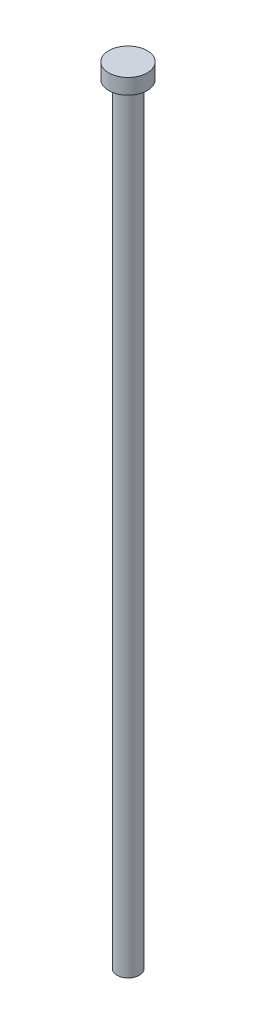
ISO-10303-21;
HEADER;
FILE_DESCRIPTION(('STEP AP214'),'2;1');
FILE_NAME('part.step','',(''),(''),'','','');
FILE_SCHEMA(('AUTOMOTIVE_DESIGN { 1 0 10303 214 1 1 1 1 }'));
ENDSEC;
DATA;
#1=APPLICATION_CONTEXT('core data for automotive mechanical design processes');
#2=APPLICATION_PROTOCOL_DEFINITION('international standard','automotive_design',2000,#1);
#3=PRODUCT_CONTEXT('',#1,'mechanical');
#4=PRODUCT('Part','Part','',(#3));
#5=PRODUCT_RELATED_PRODUCT_CATEGORY('part','',(#4));
#6=PRODUCT_DEFINITION_FORMATION('','',#4);
#7=PRODUCT_DEFINITION_CONTEXT('part definition',#1,'design');
#8=PRODUCT_DEFINITION('design','',#6,#7);
#9=PRODUCT_DEFINITION_SHAPE('','',#8);
#10=(LENGTH_UNIT() NAMED_UNIT(*) SI_UNIT(.MILLI.,.METRE.));
#11=(NAMED_UNIT(*) PLANE_ANGLE_UNIT() SI_UNIT($,.RADIAN.));
#12=(NAMED_UNIT(*) SI_UNIT($,.STERADIAN.) SOLID_ANGLE_UNIT());
#13=UNCERTAINTY_MEASURE_WITH_UNIT(LENGTH_MEASURE(1.E-05),#10,'distance_accuracy_value','');
#14=(GEOMETRIC_REPRESENTATION_CONTEXT(3) GLOBAL_UNCERTAINTY_ASSIGNED_CONTEXT((#13)) GLOBAL_UNIT_ASSIGNED_CONTEXT((#10,
#11,#12)) REPRESENTATION_CONTEXT('',''));
#15=CARTESIAN_POINT('',(0.,0.,0.));
#16=DIRECTION('',(0.,0.,1.));
#17=DIRECTION('',(1.,0.,0.));
#18=AXIS2_PLACEMENT_3D('',#15,#16,#17);
#19=CARTESIAN_POINT('',(-0.0216984538518685,100.,-0.0462661247420035));
#20=DIRECTION('',(0.,-1.,0.));
#21=DIRECTION('',(0.,0.,-1.));
#22=AXIS2_PLACEMENT_3D('',#19,#20,#21);
#23=CYLINDRICAL_SURFACE('',#22,1.45);
#24=CARTESIAN_POINT('',(-0.0216984538518685,100.,-0.0462661247420035));
#25=DIRECTION('',(0.,1.,0.));
#26=DIRECTION('',(0.,0.,1.));
#27=AXIS2_PLACEMENT_3D('',#24,#25,#26);
#28=CIRCLE('',#27,1.45);
#29=CARTESIAN_POINT('',(-0.0216984538518685,100.,1.403733875258));
#30=VERTEX_POINT('',#29);
#31=EDGE_CURVE('E10',#30,#30,#28,.T.);
#32=ORIENTED_EDGE('',*,*,#31,.F.);
#33=EDGE_LOOP('',(#32));
#34=FACE_BOUND('',#33,.T.);
#35=CARTESIAN_POINT('',(-0.0216984538518685,0.,-0.0462661247420035));
#36=DIRECTION('',(0.,1.,0.));
#37=DIRECTION('',(0.,0.,1.));
#38=AXIS2_PLACEMENT_3D('',#35,#36,#37);
#39=CIRCLE('',#38,1.45);
#40=CARTESIAN_POINT('',(-0.0216984538518685,0.,1.403733875258));
#41=VERTEX_POINT('',#40);
#42=EDGE_CURVE('E34',#41,#41,#39,.T.);
#43=ORIENTED_EDGE('',*,*,#42,.T.);
#44=EDGE_LOOP('',(#43));
#45=FACE_BOUND('',#44,.T.);
#46=ADVANCED_FACE('F31',(#34,#45),#23,.T.);
#47=CARTESIAN_POINT('',(-0.0216984538518685,0.,-0.0462661247420035));
#48=DIRECTION('',(0.,1.,0.));
#49=DIRECTION('',(0.,0.,1.));
#50=AXIS2_PLACEMENT_3D('',#47,#48,#49);
#51=PLANE('',#50);
#52=ORIENTED_EDGE('',*,*,#42,.F.);
#53=EDGE_LOOP('',(#52));
#54=FACE_BOUND('',#53,.T.);
#55=ADVANCED_FACE('F54',(#54),#51,.F.);
#56=CARTESIAN_POINT('',(0.0107297479612356,102.,0.00630272913215713));
#57=DIRECTION('',(0.,-1.,0.));
#58=DIRECTION('',(0.,0.,-1.));
#59=AXIS2_PLACEMENT_3D('',#56,#57,#58);
#60=CYLINDRICAL_SURFACE('',#59,2.5);
#61=CARTESIAN_POINT('',(0.0107297479612356,102.,0.00630272913215713));
#62=DIRECTION('',(0.,1.,0.));
#63=DIRECTION('',(0.,0.,1.));
#64=AXIS2_PLACEMENT_3D('',#61,#62,#63);
#65=CIRCLE('',#64,2.5);
#66=CARTESIAN_POINT('',(0.0107297479612356,102.,2.50630272913216));
#67=VERTEX_POINT('',#66);
#68=EDGE_CURVE('E41',#67,#67,#65,.T.);
#69=ORIENTED_EDGE('',*,*,#68,.F.);
#70=EDGE_LOOP('',(#69));
#71=FACE_BOUND('',#70,.T.);
#72=CARTESIAN_POINT('',(0.0107297479612356,100.,0.00630272913215713));
#73=DIRECTION('',(0.,1.,0.));
#74=DIRECTION('',(0.,0.,1.));
#75=AXIS2_PLACEMENT_3D('',#72,#73,#74);
#76=CIRCLE('',#75,2.5);
#77=CARTESIAN_POINT('',(0.0107297479612356,100.,2.50630272913216));
#78=VERTEX_POINT('',#77);
#79=EDGE_CURVE('E43',#78,#78,#76,.T.);
#80=ORIENTED_EDGE('',*,*,#79,.T.);
#81=EDGE_LOOP('',(#80));
#82=FACE_BOUND('',#81,.T.);
#83=ADVANCED_FACE('F51',(#71,#82),#60,.T.);
#84=CARTESIAN_POINT('',(0.0107297479612356,102.,0.00630272913215713));
#85=DIRECTION('',(0.,1.,0.));
#86=DIRECTION('',(0.,0.,1.));
#87=AXIS2_PLACEMENT_3D('',#84,#85,#86);
#88=PLANE('',#87);
#89=ORIENTED_EDGE('',*,*,#68,.T.);
#90=EDGE_LOOP('',(#89));
#91=FACE_BOUND('',#90,.T.);
#92=ADVANCED_FACE('F49',(#91),#88,.T.);
#93=CARTESIAN_POINT('',(0.0107297479612356,100.,0.00630272913215713));
#94=DIRECTION('',(0.,1.,0.));
#95=DIRECTION('',(0.,0.,1.));
#96=AXIS2_PLACEMENT_3D('',#93,#94,#95);
#97=PLANE('',#96);
#98=ORIENTED_EDGE('',*,*,#31,.T.);
#99=EDGE_LOOP('',(#98));
#100=FACE_BOUND('',#99,.T.);
#101=ORIENTED_EDGE('',*,*,#79,.F.);
#102=EDGE_LOOP('',(#101));
#103=FACE_BOUND('',#102,.T.);
#104=ADVANCED_FACE('F58',(#100,#103),#97,.F.);
#105=CLOSED_SHELL('',(#46,#55,#83,#92,#104));
#106=MANIFOLD_SOLID_BREP('B2',#105);
#107=ADVANCED_BREP_SHAPE_REPRESENTATION('',(#18,#106),#14);
#108=SHAPE_DEFINITION_REPRESENTATION(#9,#107);
ENDSEC;
END-ISO-10303-21;
